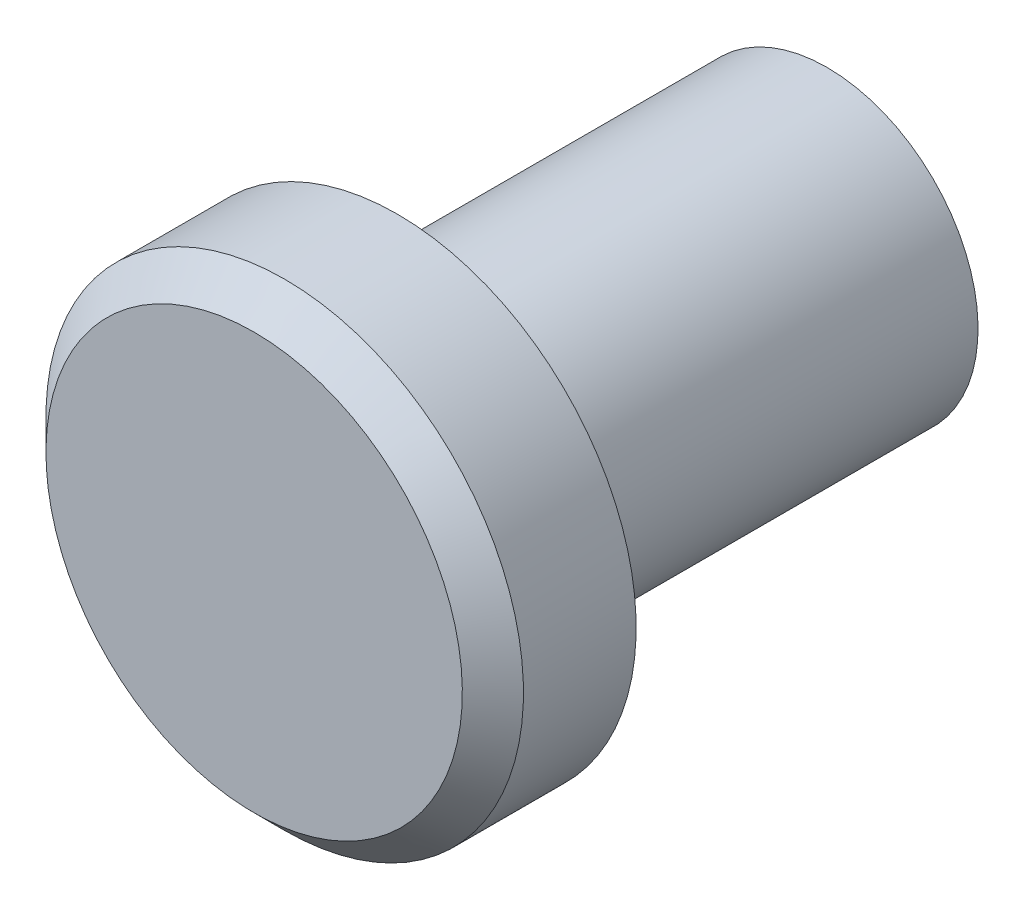
ISO-10303-21;
HEADER;
FILE_DESCRIPTION(('STEP AP214'),'2;1');
FILE_NAME('part.step','',(''),(''),'','','');
FILE_SCHEMA(('AUTOMOTIVE_DESIGN { 1 0 10303 214 1 1 1 1 }'));
ENDSEC;
DATA;
#1=APPLICATION_CONTEXT('core data for automotive mechanical design processes');
#2=APPLICATION_PROTOCOL_DEFINITION('international standard','automotive_design',2000,#1);
#3=PRODUCT_CONTEXT('',#1,'mechanical');
#4=PRODUCT('Part','Part','',(#3));
#5=PRODUCT_RELATED_PRODUCT_CATEGORY('part','',(#4));
#6=PRODUCT_DEFINITION_FORMATION('','',#4);
#7=PRODUCT_DEFINITION_CONTEXT('part definition',#1,'design');
#8=PRODUCT_DEFINITION('design','',#6,#7);
#9=PRODUCT_DEFINITION_SHAPE('','',#8);
#10=(LENGTH_UNIT() NAMED_UNIT(*) SI_UNIT(.MILLI.,.METRE.));
#11=(NAMED_UNIT(*) PLANE_ANGLE_UNIT() SI_UNIT($,.RADIAN.));
#12=(NAMED_UNIT(*) SI_UNIT($,.STERADIAN.) SOLID_ANGLE_UNIT());
#13=UNCERTAINTY_MEASURE_WITH_UNIT(LENGTH_MEASURE(1.E-05),#10,'distance_accuracy_value','');
#14=(GEOMETRIC_REPRESENTATION_CONTEXT(3) GLOBAL_UNCERTAINTY_ASSIGNED_CONTEXT((#13)) GLOBAL_UNIT_ASSIGNED_CONTEXT((#10,
#11,#12)) REPRESENTATION_CONTEXT('',''));
#15=CARTESIAN_POINT('',(0.,0.,0.));
#16=DIRECTION('',(0.,0.,1.));
#17=DIRECTION('',(1.,0.,0.));
#18=AXIS2_PLACEMENT_3D('',#15,#16,#17);
#19=CARTESIAN_POINT('',(0.,0.,0.));
#20=DIRECTION('',(0.,0.,1.));
#21=DIRECTION('',(0.,-1.,0.));
#22=AXIS2_PLACEMENT_3D('',#19,#20,#21);
#23=PLANE('',#22);
#24=CARTESIAN_POINT('',(0.,0.,0.));
#25=DIRECTION('',(0.,0.,1.));
#26=DIRECTION('',(0.,-1.,0.));
#27=AXIS2_PLACEMENT_3D('',#24,#25,#26);
#28=CIRCLE('',#27,5.5372);
#29=CARTESIAN_POINT('',(0.,5.5372,0.));
#30=VERTEX_POINT('',#29);
#31=EDGE_CURVE('E111',#30,#30,#28,.T.);
#32=ORIENTED_EDGE('',*,*,#31,.T.);
#33=EDGE_LOOP('',(#32));
#34=FACE_BOUND('',#33,.T.);
#35=ADVANCED_FACE('F44',(#34),#23,.T.);
#36=CARTESIAN_POINT('',(0.,0.,-1.52400000000001));
#37=DIRECTION('',(0.,0.,-1.));
#38=DIRECTION('',(0.,1.,0.));
#39=AXIS2_PLACEMENT_3D('',#36,#37,#38);
#40=CYLINDRICAL_SURFACE('',#39,6.35);
#41=CARTESIAN_POINT('',(0.,0.,-0.812799999999996));
#42=DIRECTION('',(0.,0.,1.));
#43=DIRECTION('',(0.,-1.,0.));
#44=AXIS2_PLACEMENT_3D('',#41,#42,#43);
#45=CIRCLE('',#44,6.35);
#46=CARTESIAN_POINT('',(0.,6.35,-0.812799999999998));
#47=VERTEX_POINT('',#46);
#48=EDGE_CURVE('E108',#47,#47,#45,.F.);
#49=ORIENTED_EDGE('',*,*,#48,.T.);
#50=EDGE_LOOP('',(#49));
#51=FACE_BOUND('',#50,.T.);
#52=CARTESIAN_POINT('',(0.,0.,-3.81));
#53=DIRECTION('',(0.,0.,-1.));
#54=DIRECTION('',(0.,1.,0.));
#55=AXIS2_PLACEMENT_3D('',#52,#53,#54);
#56=CIRCLE('',#55,6.35);
#57=CARTESIAN_POINT('',(0.,6.35,-3.81));
#58=VERTEX_POINT('',#57);
#59=EDGE_CURVE('E102',#58,#58,#56,.T.);
#60=ORIENTED_EDGE('',*,*,#59,.F.);
#61=EDGE_LOOP('',(#60));
#62=FACE_BOUND('',#61,.T.);
#63=ADVANCED_FACE('F70',(#51,#62),#40,.T.);
#64=CARTESIAN_POINT('',(0.,6.35,-3.81));
#65=DIRECTION('',(0.,0.,-1.));
#66=DIRECTION('',(0.,1.,0.));
#67=AXIS2_PLACEMENT_3D('',#64,#65,#66);
#68=PLANE('',#67);
#69=ORIENTED_EDGE('',*,*,#59,.T.);
#70=EDGE_LOOP('',(#69));
#71=FACE_BOUND('',#70,.T.);
#72=CARTESIAN_POINT('',(0.,0.,-3.81));
#73=DIRECTION('',(0.,0.,-1.));
#74=DIRECTION('',(0.,1.,0.));
#75=AXIS2_PLACEMENT_3D('',#72,#73,#74);
#76=CIRCLE('',#75,4.0132);
#77=CARTESIAN_POINT('',(0.,4.0132,-3.81));
#78=VERTEX_POINT('',#77);
#79=EDGE_CURVE('E98',#78,#78,#76,.T.);
#80=ORIENTED_EDGE('',*,*,#79,.F.);
#81=EDGE_LOOP('',(#80));
#82=FACE_BOUND('',#81,.T.);
#83=ADVANCED_FACE('F76',(#71,#82),#68,.T.);
#84=CARTESIAN_POINT('',(0.,0.,-1.52400000000001));
#85=DIRECTION('',(0.,0.,-1.));
#86=DIRECTION('',(0.,1.,0.));
#87=AXIS2_PLACEMENT_3D('',#84,#85,#86);
#88=CYLINDRICAL_SURFACE('',#87,4.0132);
#89=ORIENTED_EDGE('',*,*,#79,.T.);
#90=EDGE_LOOP('',(#89));
#91=FACE_BOUND('',#90,.T.);
#92=CARTESIAN_POINT('',(0.,0.,-15.24));
#93=DIRECTION('',(0.,0.,-1.));
#94=DIRECTION('',(0.,1.,0.));
#95=AXIS2_PLACEMENT_3D('',#92,#93,#94);
#96=CIRCLE('',#95,4.0132);
#97=CARTESIAN_POINT('',(0.,4.0132,-15.24));
#98=VERTEX_POINT('',#97);
#99=EDGE_CURVE('E96',#98,#98,#96,.T.);
#100=ORIENTED_EDGE('',*,*,#99,.F.);
#101=EDGE_LOOP('',(#100));
#102=FACE_BOUND('',#101,.T.);
#103=ADVANCED_FACE('F83',(#91,#102),#88,.T.);
#104=CARTESIAN_POINT('',(0.,4.0132,-15.24));
#105=DIRECTION('',(0.,0.,-1.));
#106=DIRECTION('',(0.,1.,0.));
#107=AXIS2_PLACEMENT_3D('',#104,#105,#106);
#108=PLANE('',#107);
#109=CARTESIAN_POINT('',(0.,0.,-15.24));
#110=DIRECTION('',(0.,0.,-1.));
#111=DIRECTION('',(0.,1.,0.));
#112=AXIS2_PLACEMENT_3D('',#109,#110,#111);
#113=CIRCLE('',#112,3.73380000000002);
#114=CARTESIAN_POINT('',(0.,3.73380000000001,-15.24));
#115=VERTEX_POINT('',#114);
#116=EDGE_CURVE('E13',#115,#115,#113,.F.);
#117=ORIENTED_EDGE('',*,*,#116,.T.);
#118=EDGE_LOOP('',(#117));
#119=FACE_BOUND('',#118,.T.);
#120=ORIENTED_EDGE('',*,*,#99,.T.);
#121=EDGE_LOOP('',(#120));
#122=FACE_BOUND('',#121,.T.);
#123=ADVANCED_FACE('F65',(#119,#122),#108,.T.);
#124=CARTESIAN_POINT('',(0.,0.,-1.52400000000001));
#125=DIRECTION('',(0.,0.,-1.));
#126=DIRECTION('',(0.,1.,0.));
#127=AXIS2_PLACEMENT_3D('',#124,#125,#126);
#128=CYLINDRICAL_SURFACE('',#127,2.92100000000001);
#129=CARTESIAN_POINT('',(0.,0.,-14.4272));
#130=DIRECTION('',(0.,0.,-1.));
#131=DIRECTION('',(0.,1.,0.));
#132=AXIS2_PLACEMENT_3D('',#129,#130,#131);
#133=CIRCLE('',#132,2.92100000000001);
#134=CARTESIAN_POINT('',(0.,2.921,-14.4272));
#135=VERTEX_POINT('',#134);
#136=EDGE_CURVE('E51',#135,#135,#133,.T.);
#137=ORIENTED_EDGE('',*,*,#136,.T.);
#138=EDGE_LOOP('',(#137));
#139=FACE_BOUND('',#138,.T.);
#140=CARTESIAN_POINT('',(0.,0.,-4.445));
#141=DIRECTION('',(0.,0.,-1.));
#142=DIRECTION('',(0.,1.,0.));
#143=AXIS2_PLACEMENT_3D('',#140,#141,#142);
#144=CIRCLE('',#143,2.921);
#145=CARTESIAN_POINT('',(0.,2.921,-4.445));
#146=VERTEX_POINT('',#145);
#147=EDGE_CURVE('E99',#146,#146,#144,.T.);
#148=ORIENTED_EDGE('',*,*,#147,.F.);
#149=EDGE_LOOP('',(#148));
#150=FACE_BOUND('',#149,.T.);
#151=ADVANCED_FACE('F57',(#139,#150),#128,.F.);
#152=CARTESIAN_POINT('',(0.,0.,-1.52400000000001));
#153=DIRECTION('',(0.,0.,-1.));
#154=DIRECTION('',(0.,1.,0.));
#155=AXIS2_PLACEMENT_3D('',#152,#153,#154);
#156=CONICAL_SURFACE('',#155,0.,0.785398163397451);
#157=ORIENTED_EDGE('',*,*,#147,.T.);
#158=EDGE_LOOP('',(#157));
#159=FACE_BOUND('',#158,.T.);
#160=CARTESIAN_POINT('',(0.,0.,-1.52400000000001));
#161=VERTEX_POINT('',#160);
#162=VERTEX_LOOP('',#161);
#163=FACE_BOUND('',#162,.T.);
#164=ADVANCED_FACE('F54',(#159,#163),#156,.F.);
#165=CARTESIAN_POINT('',(0.,0.,-0.812799999999997));
#166=DIRECTION('',(0.,0.,-1.));
#167=DIRECTION('',(0.,1.,0.));
#168=AXIS2_PLACEMENT_3D('',#165,#166,#167);
#169=CONICAL_SURFACE('',#168,6.35,0.785398163397449);
#170=CARTESIAN_POINT('',(0.,5.5372,0.));
#171=CARTESIAN_POINT('',(0.,5.54566666666667,-0.00846666666666738));
#172=CARTESIAN_POINT('',(0.,5.55413333333333,-0.016933333333334));
#173=CARTESIAN_POINT('',(0.,5.57106666666667,-0.0338666666666672));
#174=CARTESIAN_POINT('',(0.,5.57953333333333,-0.0423333333333338));
#175=CARTESIAN_POINT('',(0.,5.59646666666667,-0.0592666666666671));
#176=CARTESIAN_POINT('',(0.,5.60493333333333,-0.0677333333333337));
#177=CARTESIAN_POINT('',(0.,5.62186666666667,-0.084666666666667));
#178=CARTESIAN_POINT('',(0.,5.63033333333333,-0.0931333333333337));
#179=CARTESIAN_POINT('',(0.,5.64726666666667,-0.110066666666667));
#180=CARTESIAN_POINT('',(0.,5.65573333333333,-0.118533333333334));
#181=CARTESIAN_POINT('',(0.,5.67266666666667,-0.135466666666667));
#182=CARTESIAN_POINT('',(0.,5.68113333333333,-0.143933333333333));
#183=CARTESIAN_POINT('',(0.,5.69806666666667,-0.160866666666667));
#184=CARTESIAN_POINT('',(0.,5.70653333333333,-0.169333333333333));
#185=CARTESIAN_POINT('',(0.,5.72346666666667,-0.186266666666667));
#186=CARTESIAN_POINT('',(0.,5.73193333333333,-0.194733333333333));
#187=CARTESIAN_POINT('',(0.,5.74886666666667,-0.211666666666666));
#188=CARTESIAN_POINT('',(0.,5.75733333333333,-0.220133333333333));
#189=CARTESIAN_POINT('',(0.,5.77426666666667,-0.237066666666666));
#190=CARTESIAN_POINT('',(0.,5.78273333333333,-0.245533333333333));
#191=CARTESIAN_POINT('',(0.,5.79966666666667,-0.262466666666666));
#192=CARTESIAN_POINT('',(0.,5.80813333333333,-0.270933333333333));
#193=CARTESIAN_POINT('',(0.,5.82506666666667,-0.287866666666666));
#194=CARTESIAN_POINT('',(0.,5.83353333333333,-0.296333333333333));
#195=CARTESIAN_POINT('',(0.,5.85046666666667,-0.313266666666666));
#196=CARTESIAN_POINT('',(0.,5.85893333333333,-0.321733333333333));
#197=CARTESIAN_POINT('',(0.,5.87586666666667,-0.338666666666666));
#198=CARTESIAN_POINT('',(0.,5.88433333333333,-0.347133333333333));
#199=CARTESIAN_POINT('',(0.,5.90126666666667,-0.364066666666666));
#200=CARTESIAN_POINT('',(0.,5.90973333333333,-0.372533333333332));
#201=CARTESIAN_POINT('',(0.,5.92666666666667,-0.389466666666666));
#202=CARTESIAN_POINT('',(0.,5.93513333333333,-0.397933333333332));
#203=CARTESIAN_POINT('',(0.,5.95206666666667,-0.414866666666666));
#204=CARTESIAN_POINT('',(0.,5.96053333333333,-0.423333333333332));
#205=CARTESIAN_POINT('',(0.,5.97746666666667,-0.440266666666666));
#206=CARTESIAN_POINT('',(0.,5.98593333333333,-0.448733333333332));
#207=CARTESIAN_POINT('',(0.,6.00286666666667,-0.465666666666666));
#208=CARTESIAN_POINT('',(0.,6.01133333333333,-0.474133333333332));
#209=CARTESIAN_POINT('',(0.,6.02826666666667,-0.491066666666666));
#210=CARTESIAN_POINT('',(0.,6.03673333333333,-0.499533333333332));
#211=CARTESIAN_POINT('',(0.,6.05366666666667,-0.516466666666665));
#212=CARTESIAN_POINT('',(0.,6.06213333333333,-0.524933333333332));
#213=CARTESIAN_POINT('',(0.,6.07906666666667,-0.541866666666665));
#214=CARTESIAN_POINT('',(0.,6.08753333333333,-0.550333333333332));
#215=CARTESIAN_POINT('',(0.,6.10446666666667,-0.567266666666665));
#216=CARTESIAN_POINT('',(0.,6.11293333333333,-0.575733333333332));
#217=CARTESIAN_POINT('',(0.,6.12986666666667,-0.592666666666665));
#218=CARTESIAN_POINT('',(0.,6.13833333333333,-0.601133333333332));
#219=CARTESIAN_POINT('',(0.,6.15526666666667,-0.618066666666665));
#220=CARTESIAN_POINT('',(0.,6.16373333333333,-0.626533333333331));
#221=CARTESIAN_POINT('',(0.,6.18066666666667,-0.643466666666665));
#222=CARTESIAN_POINT('',(0.,6.18913333333333,-0.651933333333331));
#223=CARTESIAN_POINT('',(0.,6.20606666666667,-0.668866666666665));
#224=CARTESIAN_POINT('',(0.,6.21453333333333,-0.677333333333331));
#225=CARTESIAN_POINT('',(0.,6.23146666666667,-0.694266666666664));
#226=CARTESIAN_POINT('',(0.,6.23993333333333,-0.702733333333331));
#227=CARTESIAN_POINT('',(0.,6.25686666666667,-0.719666666666664));
#228=CARTESIAN_POINT('',(0.,6.26533333333333,-0.728133333333331));
#229=CARTESIAN_POINT('',(0.,6.28226666666667,-0.745066666666664));
#230=CARTESIAN_POINT('',(0.,6.29073333333333,-0.753533333333331));
#231=CARTESIAN_POINT('',(0.,6.30766666666667,-0.770466666666665));
#232=CARTESIAN_POINT('',(0.,6.31613333333333,-0.778933333333331));
#233=CARTESIAN_POINT('',(0.,6.33306666666667,-0.795866666666664));
#234=CARTESIAN_POINT('',(0.,6.34153333333333,-0.804333333333331));
#235=CARTESIAN_POINT('',(0.,6.35,-0.812799999999998));
#236=B_SPLINE_CURVE_WITH_KNOTS('',3,(#170,#171,#172,#173,#174,#175,#176,#177,#178,#179,#180,
#181,#182,#183,#184,#185,#186,#187,#188,#189,#190,#191,#192,#193,#194,#195,#196,#197,#198,#199,
#200,#201,#202,#203,#204,#205,#206,#207,#208,#209,#210,#211,#212,#213,#214,#215,#216,#217,#218,
#219,#220,#221,#222,#223,#224,#225,#226,#227,#228,#229,#230,#231,#232,#233,#234,#235),
.UNSPECIFIED.,.F.,.F.,(4,2,2,2,2,2,2,2,2,2,2,2,2,2,2,2,2,2,2,2,2,2,2,2,2,2,2,2,2,2,2,2,4),(0.,
0.035921024484276,0.0718420489685526,0.107763073452829,0.143684097937106,0.179605122421382,
0.215526146905659,0.251447171389935,0.287368195874212,0.323289220358488,0.359210244842765,
0.395131269327041,0.431052293811317,0.466973318295594,0.50289434277987,0.538815367264147,
0.574736391748424,0.6106574162327,0.646578440716977,0.682499465201253,0.71842048968553,
0.754341514169806,0.790262538654083,0.826183563138359,0.862104587622635,0.898025612106912,
0.933946636591189,0.969867661075465,1.00578868555974,1.04170971004402,1.07763073452829,
1.11355175901257,1.14947278349685),.UNSPECIFIED.);
#237=EDGE_CURVE('BSEAM56',#30,#47,#236,.T.);
#238=ORIENTED_EDGE('',*,*,#31,.F.);
#239=ORIENTED_EDGE('',*,*,#48,.F.);
#240=ORIENTED_EDGE('',*,*,#237,.T.);
#241=ORIENTED_EDGE('',*,*,#237,.F.);
#242=EDGE_LOOP('',(#238,#240,#239,#241));
#243=FACE_BOUND('',#242,.T.);
#244=ADVANCED_FACE('F56',(#243),#169,.T.);
#245=CARTESIAN_POINT('',(0.,0.,-14.4272));
#246=DIRECTION('',(0.,0.,-1.));
#247=DIRECTION('',(0.,1.,0.));
#248=AXIS2_PLACEMENT_3D('',#245,#246,#247);
#249=CONICAL_SURFACE('',#248,2.92100000000001,0.78539816339745);
#250=ORIENTED_EDGE('',*,*,#116,.F.);
#251=EDGE_LOOP('',(#250));
#252=FACE_BOUND('',#251,.T.);
#253=ORIENTED_EDGE('',*,*,#136,.F.);
#254=EDGE_LOOP('',(#253));
#255=FACE_BOUND('',#254,.T.);
#256=ADVANCED_FACE('F46',(#252,#255),#249,.F.);
#257=CLOSED_SHELL('',(#35,#63,#83,#103,#123,#151,#164,#244,#256));
#258=MANIFOLD_SOLID_BREP('B2',#257);
#259=ADVANCED_BREP_SHAPE_REPRESENTATION('',(#18,#258),#14);
#260=SHAPE_DEFINITION_REPRESENTATION(#9,#259);
ENDSEC;
END-ISO-10303-21;
